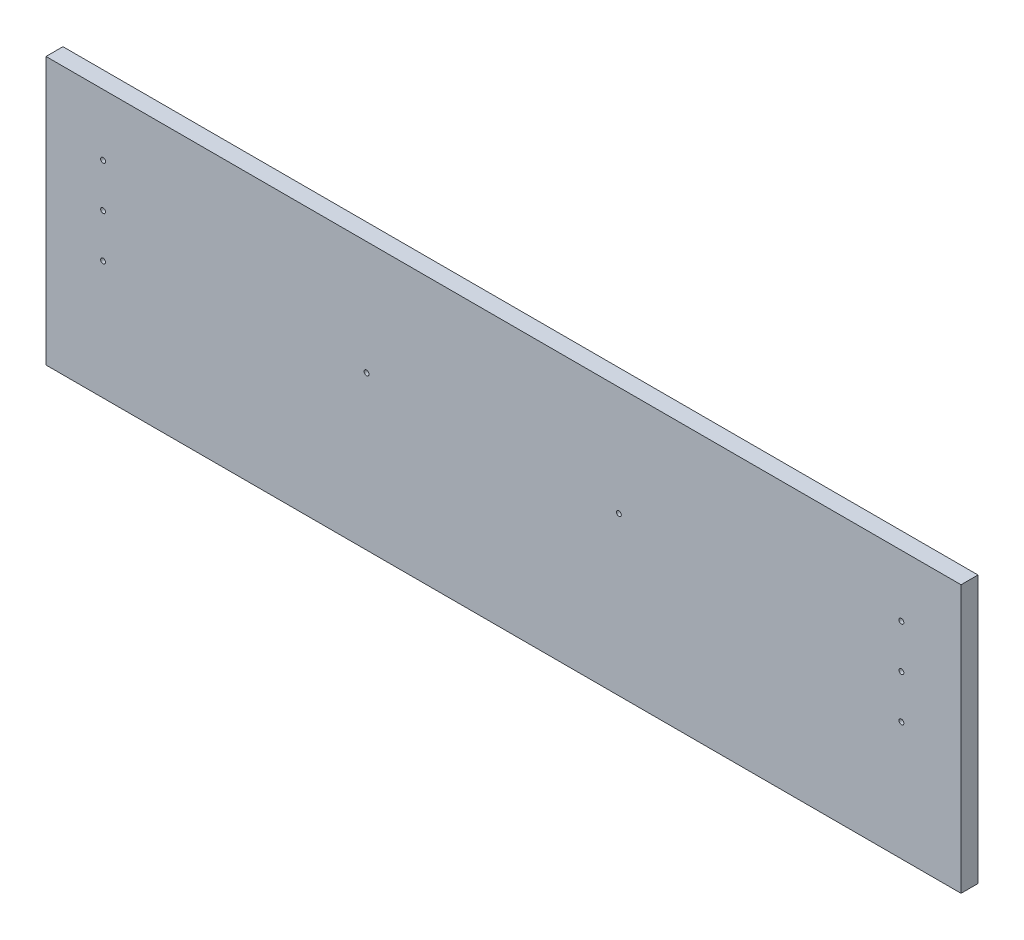
ISO-10303-21;
HEADER;
FILE_DESCRIPTION(('STEP AP214'),'2;1');
FILE_NAME('part.step','',(''),(''),'','','');
FILE_SCHEMA(('AUTOMOTIVE_DESIGN { 1 0 10303 214 1 1 1 1 }'));
ENDSEC;
DATA;
#1=APPLICATION_CONTEXT('core data for automotive mechanical design processes');
#2=APPLICATION_PROTOCOL_DEFINITION('international standard','automotive_design',2000,#1);
#3=PRODUCT_CONTEXT('',#1,'mechanical');
#4=PRODUCT('Part','Part','',(#3));
#5=PRODUCT_RELATED_PRODUCT_CATEGORY('part','',(#4));
#6=PRODUCT_DEFINITION_FORMATION('','',#4);
#7=PRODUCT_DEFINITION_CONTEXT('part definition',#1,'design');
#8=PRODUCT_DEFINITION('design','',#6,#7);
#9=PRODUCT_DEFINITION_SHAPE('','',#8);
#10=(LENGTH_UNIT() NAMED_UNIT(*) SI_UNIT(.MILLI.,.METRE.));
#11=(NAMED_UNIT(*) PLANE_ANGLE_UNIT() SI_UNIT($,.RADIAN.));
#12=(NAMED_UNIT(*) SI_UNIT($,.STERADIAN.) SOLID_ANGLE_UNIT());
#13=UNCERTAINTY_MEASURE_WITH_UNIT(LENGTH_MEASURE(1.E-05),#10,'distance_accuracy_value','');
#14=(GEOMETRIC_REPRESENTATION_CONTEXT(3) GLOBAL_UNCERTAINTY_ASSIGNED_CONTEXT((#13)) GLOBAL_UNIT_ASSIGNED_CONTEXT((#10,
#11,#12)) REPRESENTATION_CONTEXT('',''));
#15=CARTESIAN_POINT('',(0.,0.,0.));
#16=DIRECTION('',(0.,0.,1.));
#17=DIRECTION('',(1.,0.,0.));
#18=AXIS2_PLACEMENT_3D('',#15,#16,#17);
#19=CARTESIAN_POINT('',(-1865.91988168822,503.735981281029,19.));
#20=DIRECTION('',(1.,0.,0.));
#21=DIRECTION('',(0.,0.,-1.));
#22=AXIS2_PLACEMENT_3D('',#19,#20,#21);
#23=PLANE('',#22);
#24=DIRECTION('',(0.,-1.,0.));
#25=VECTOR('',#24,1.);
#26=CARTESIAN_POINT('',(-1865.91988168822,503.735981281029,0.));
#27=LINE('',#26,#25);
#28=CARTESIAN_POINT('',(-1865.91988168822,803.235981281028,0.));
#29=VERTEX_POINT('',#28);
#30=CARTESIAN_POINT('',(-1865.91988168822,503.735981281029,0.));
#31=VERTEX_POINT('',#30);
#32=EDGE_CURVE('E95',#29,#31,#27,.T.);
#33=ORIENTED_EDGE('',*,*,#32,.T.);
#34=DIRECTION('',(0.,0.,-1.));
#35=VECTOR('',#34,1.);
#36=CARTESIAN_POINT('',(-1865.91988168822,503.735981281029,19.));
#37=LINE('',#36,#35);
#38=CARTESIAN_POINT('',(-1865.91988168822,503.735981281029,19.));
#39=VERTEX_POINT('',#38);
#40=EDGE_CURVE('E11',#39,#31,#37,.T.);
#41=ORIENTED_EDGE('',*,*,#40,.F.);
#42=DIRECTION('',(0.,-1.,0.));
#43=VECTOR('',#42,1.);
#44=CARTESIAN_POINT('',(-1865.91988168822,503.735981281029,19.));
#45=LINE('',#44,#43);
#46=CARTESIAN_POINT('',(-1865.91988168822,803.235981281028,19.));
#47=VERTEX_POINT('',#46);
#48=EDGE_CURVE('E83',#47,#39,#45,.T.);
#49=ORIENTED_EDGE('',*,*,#48,.F.);
#50=DIRECTION('',(0.,0.,-1.));
#51=VECTOR('',#50,1.);
#52=CARTESIAN_POINT('',(-1865.91988168822,803.235981281028,19.));
#53=LINE('',#52,#51);
#54=EDGE_CURVE('E91',#47,#29,#53,.T.);
#55=ORIENTED_EDGE('',*,*,#54,.T.);
#56=EDGE_LOOP('',(#33,#41,#49,#55));
#57=FACE_BOUND('',#56,.T.);
#58=ADVANCED_FACE('F32',(#57),#23,.F.);
#59=CARTESIAN_POINT('',(-1865.91988168822,503.735981281029,19.));
#60=DIRECTION('',(0.,1.,0.));
#61=DIRECTION('',(0.,0.,1.));
#62=AXIS2_PLACEMENT_3D('',#59,#60,#61);
#63=PLANE('',#62);
#64=DIRECTION('',(1.,0.,0.));
#65=VECTOR('',#64,1.);
#66=CARTESIAN_POINT('',(-1865.91988168822,503.735981281029,0.));
#67=LINE('',#66,#65);
#68=CARTESIAN_POINT('',(-840.458601323646,503.735981281029,0.));
#69=VERTEX_POINT('',#68);
#70=EDGE_CURVE('E87',#31,#69,#67,.T.);
#71=ORIENTED_EDGE('',*,*,#70,.T.);
#72=DIRECTION('',(0.,0.,-1.));
#73=VECTOR('',#72,1.);
#74=CARTESIAN_POINT('',(-840.458601323646,503.735981281029,19.));
#75=LINE('',#74,#73);
#76=CARTESIAN_POINT('',(-840.458601323646,503.735981281029,19.));
#77=VERTEX_POINT('',#76);
#78=EDGE_CURVE('E40',#77,#69,#75,.T.);
#79=ORIENTED_EDGE('',*,*,#78,.F.);
#80=DIRECTION('',(1.,0.,0.));
#81=VECTOR('',#80,1.);
#82=CARTESIAN_POINT('',(-1865.91988168822,503.735981281029,19.));
#83=LINE('',#82,#81);
#84=EDGE_CURVE('E78',#39,#77,#83,.T.);
#85=ORIENTED_EDGE('',*,*,#84,.F.);
#86=ORIENTED_EDGE('',*,*,#40,.T.);
#87=EDGE_LOOP('',(#71,#79,#85,#86));
#88=FACE_BOUND('',#87,.T.);
#89=ADVANCED_FACE('F86',(#88),#63,.F.);
#90=CARTESIAN_POINT('',(-840.458601323646,503.735981281029,19.));
#91=DIRECTION('',(-1.,0.,0.));
#92=DIRECTION('',(0.,0.,1.));
#93=AXIS2_PLACEMENT_3D('',#90,#91,#92);
#94=PLANE('',#93);
#95=DIRECTION('',(0.,1.,0.));
#96=VECTOR('',#95,1.);
#97=CARTESIAN_POINT('',(-840.458601323646,503.735981281029,0.));
#98=LINE('',#97,#96);
#99=CARTESIAN_POINT('',(-840.458601323646,803.235981281028,0.));
#100=VERTEX_POINT('',#99);
#101=EDGE_CURVE('E65',#69,#100,#98,.T.);
#102=ORIENTED_EDGE('',*,*,#101,.T.);
#103=DIRECTION('',(0.,0.,-1.));
#104=VECTOR('',#103,1.);
#105=CARTESIAN_POINT('',(-840.458601323646,803.235981281028,19.));
#106=LINE('',#105,#104);
#107=CARTESIAN_POINT('',(-840.458601323646,803.235981281028,19.));
#108=VERTEX_POINT('',#107);
#109=EDGE_CURVE('E88',#108,#100,#106,.T.);
#110=ORIENTED_EDGE('',*,*,#109,.F.);
#111=DIRECTION('',(0.,1.,0.));
#112=VECTOR('',#111,1.);
#113=CARTESIAN_POINT('',(-840.458601323646,503.735981281029,19.));
#114=LINE('',#113,#112);
#115=EDGE_CURVE('E81',#77,#108,#114,.T.);
#116=ORIENTED_EDGE('',*,*,#115,.F.);
#117=ORIENTED_EDGE('',*,*,#78,.T.);
#118=EDGE_LOOP('',(#102,#110,#116,#117));
#119=FACE_BOUND('',#118,.T.);
#120=ADVANCED_FACE('F89',(#119),#94,.F.);
#121=CARTESIAN_POINT('',(-1865.91988168822,803.235981281028,19.));
#122=DIRECTION('',(0.,-1.,0.));
#123=DIRECTION('',(0.,0.,-1.));
#124=AXIS2_PLACEMENT_3D('',#121,#122,#123);
#125=PLANE('',#124);
#126=DIRECTION('',(-1.,0.,0.));
#127=VECTOR('',#126,1.);
#128=CARTESIAN_POINT('',(-1865.91988168822,803.235981281028,0.));
#129=LINE('',#128,#127);
#130=EDGE_CURVE('E71',#100,#29,#129,.T.);
#131=ORIENTED_EDGE('',*,*,#130,.T.);
#132=ORIENTED_EDGE('',*,*,#54,.F.);
#133=DIRECTION('',(-1.,0.,0.));
#134=VECTOR('',#133,1.);
#135=CARTESIAN_POINT('',(-1865.91988168822,803.235981281028,19.));
#136=LINE('',#135,#134);
#137=EDGE_CURVE('E48',#108,#47,#136,.T.);
#138=ORIENTED_EDGE('',*,*,#137,.F.);
#139=ORIENTED_EDGE('',*,*,#109,.T.);
#140=EDGE_LOOP('',(#131,#132,#138,#139));
#141=FACE_BOUND('',#140,.T.);
#142=ADVANCED_FACE('F103',(#141),#125,.F.);
#143=CARTESIAN_POINT('',(0.,0.,19.));
#144=DIRECTION('',(0.,0.,-1.));
#145=DIRECTION('',(-1.,0.,0.));
#146=AXIS2_PLACEMENT_3D('',#143,#144,#145);
#147=PLANE('',#146);
#148=CARTESIAN_POINT('',(-1801.94296472096,734.466309612033,19.));
#149=DIRECTION('',(0.,0.,-1.));
#150=DIRECTION('',(-1.,0.,0.));
#151=AXIS2_PLACEMENT_3D('',#148,#149,#150);
#152=CIRCLE('',#151,2.75000000000003);
#153=CARTESIAN_POINT('',(-1804.69296472096,734.466309612033,19.));
#154=VERTEX_POINT('',#153);
#155=EDGE_CURVE('E150',#154,#154,#152,.T.);
#156=ORIENTED_EDGE('',*,*,#155,.T.);
#157=EDGE_LOOP('',(#156));
#158=FACE_BOUND('',#157,.T.);
#159=CARTESIAN_POINT('',(-1801.94296472096,685.60086817557,19.));
#160=DIRECTION('',(0.,0.,-1.));
#161=DIRECTION('',(-1.,0.,0.));
#162=AXIS2_PLACEMENT_3D('',#159,#160,#161);
#163=CIRCLE('',#162,2.75000000000003);
#164=CARTESIAN_POINT('',(-1804.69296472096,685.60086817557,19.));
#165=VERTEX_POINT('',#164);
#166=EDGE_CURVE('E144',#165,#165,#163,.T.);
#167=ORIENTED_EDGE('',*,*,#166,.T.);
#168=EDGE_LOOP('',(#167));
#169=FACE_BOUND('',#168,.T.);
#170=CARTESIAN_POINT('',(-1801.94296472096,636.730868960784,19.));
#171=DIRECTION('',(0.,0.,-1.));
#172=DIRECTION('',(-1.,0.,0.));
#173=AXIS2_PLACEMENT_3D('',#170,#171,#172);
#174=CIRCLE('',#173,2.75000000000003);
#175=CARTESIAN_POINT('',(-1804.69296472096,636.730868960784,19.));
#176=VERTEX_POINT('',#175);
#177=EDGE_CURVE('E138',#176,#176,#174,.T.);
#178=ORIENTED_EDGE('',*,*,#177,.T.);
#179=EDGE_LOOP('',(#178));
#180=FACE_BOUND('',#179,.T.);
#181=CARTESIAN_POINT('',(-907.32133425273,734.466309612041,19.));
#182=DIRECTION('',(0.,0.,-1.));
#183=DIRECTION('',(-1.,0.,0.));
#184=AXIS2_PLACEMENT_3D('',#181,#182,#183);
#185=CIRCLE('',#184,2.75000000000003);
#186=CARTESIAN_POINT('',(-910.07133425273,734.466309612041,19.));
#187=VERTEX_POINT('',#186);
#188=EDGE_CURVE('E132',#187,#187,#185,.T.);
#189=ORIENTED_EDGE('',*,*,#188,.T.);
#190=EDGE_LOOP('',(#189));
#191=FACE_BOUND('',#190,.T.);
#192=CARTESIAN_POINT('',(-907.32133425273,685.595868960792,19.));
#193=DIRECTION('',(0.,0.,-1.));
#194=DIRECTION('',(-1.,0.,0.));
#195=AXIS2_PLACEMENT_3D('',#192,#193,#194);
#196=CIRCLE('',#195,2.75000000000003);
#197=CARTESIAN_POINT('',(-910.07133425273,685.595868960792,19.));
#198=VERTEX_POINT('',#197);
#199=EDGE_CURVE('E126',#198,#198,#196,.T.);
#200=ORIENTED_EDGE('',*,*,#199,.T.);
#201=EDGE_LOOP('',(#200));
#202=FACE_BOUND('',#201,.T.);
#203=CARTESIAN_POINT('',(-907.321334252729,636.736313815604,19.));
#204=DIRECTION('',(0.,0.,-1.));
#205=DIRECTION('',(-1.,0.,0.));
#206=AXIS2_PLACEMENT_3D('',#203,#204,#205);
#207=CIRCLE('',#206,2.75000000000003);
#208=CARTESIAN_POINT('',(-910.071334252729,636.736313815604,19.));
#209=VERTEX_POINT('',#208);
#210=EDGE_CURVE('E120',#209,#209,#207,.T.);
#211=ORIENTED_EDGE('',*,*,#210,.T.);
#212=EDGE_LOOP('',(#211));
#213=FACE_BOUND('',#212,.T.);
#214=CARTESIAN_POINT('',(-1223.96319940512,680.679650287803,19.));
#215=DIRECTION('',(0.,0.,-1.));
#216=DIRECTION('',(-1.,0.,0.));
#217=AXIS2_PLACEMENT_3D('',#214,#215,#216);
#218=CIRCLE('',#217,2.75000000000003);
#219=CARTESIAN_POINT('',(-1226.71319940512,680.679650287803,19.));
#220=VERTEX_POINT('',#219);
#221=EDGE_CURVE('E114',#220,#220,#218,.T.);
#222=ORIENTED_EDGE('',*,*,#221,.T.);
#223=EDGE_LOOP('',(#222));
#224=FACE_BOUND('',#223,.T.);
#225=CARTESIAN_POINT('',(-1506.67598122684,675.762846283049,19.));
#226=DIRECTION('',(0.,0.,-1.));
#227=DIRECTION('',(-1.,0.,0.));
#228=AXIS2_PLACEMENT_3D('',#225,#226,#227);
#229=CIRCLE('',#228,2.75000000000003);
#230=CARTESIAN_POINT('',(-1509.42598122684,675.762846283049,19.));
#231=VERTEX_POINT('',#230);
#232=EDGE_CURVE('E98',#231,#231,#229,.T.);
#233=ORIENTED_EDGE('',*,*,#232,.T.);
#234=EDGE_LOOP('',(#233));
#235=FACE_BOUND('',#234,.T.);
#236=ORIENTED_EDGE('',*,*,#48,.T.);
#237=ORIENTED_EDGE('',*,*,#84,.T.);
#238=ORIENTED_EDGE('',*,*,#115,.T.);
#239=ORIENTED_EDGE('',*,*,#137,.T.);
#240=EDGE_LOOP('',(#236,#237,#238,#239));
#241=FACE_BOUND('',#240,.T.);
#242=ADVANCED_FACE('F79',(#158,#169,#180,#191,#202,#213,#224,#235,#241),#147,.F.);
#243=CARTESIAN_POINT('',(0.,0.,0.));
#244=DIRECTION('',(0.,0.,-1.));
#245=DIRECTION('',(-1.,0.,0.));
#246=AXIS2_PLACEMENT_3D('',#243,#244,#245);
#247=PLANE('',#246);
#248=CARTESIAN_POINT('',(-1801.94296472096,734.466309612033,0.));
#249=DIRECTION('',(0.,0.,-1.));
#250=DIRECTION('',(-1.,0.,0.));
#251=AXIS2_PLACEMENT_3D('',#248,#249,#250);
#252=CIRCLE('',#251,2.75000000000003);
#253=CARTESIAN_POINT('',(-1804.69296472096,734.466309612033,0.));
#254=VERTEX_POINT('',#253);
#255=EDGE_CURVE('E153',#254,#254,#252,.T.);
#256=ORIENTED_EDGE('',*,*,#255,.F.);
#257=EDGE_LOOP('',(#256));
#258=FACE_BOUND('',#257,.T.);
#259=CARTESIAN_POINT('',(-1801.94296472096,685.60086817557,0.));
#260=DIRECTION('',(0.,0.,-1.));
#261=DIRECTION('',(-1.,0.,0.));
#262=AXIS2_PLACEMENT_3D('',#259,#260,#261);
#263=CIRCLE('',#262,2.75000000000003);
#264=CARTESIAN_POINT('',(-1804.69296472096,685.60086817557,0.));
#265=VERTEX_POINT('',#264);
#266=EDGE_CURVE('E147',#265,#265,#263,.T.);
#267=ORIENTED_EDGE('',*,*,#266,.F.);
#268=EDGE_LOOP('',(#267));
#269=FACE_BOUND('',#268,.T.);
#270=CARTESIAN_POINT('',(-1801.94296472096,636.730868960784,0.));
#271=DIRECTION('',(0.,0.,-1.));
#272=DIRECTION('',(-1.,0.,0.));
#273=AXIS2_PLACEMENT_3D('',#270,#271,#272);
#274=CIRCLE('',#273,2.75000000000003);
#275=CARTESIAN_POINT('',(-1804.69296472096,636.730868960784,0.));
#276=VERTEX_POINT('',#275);
#277=EDGE_CURVE('E141',#276,#276,#274,.T.);
#278=ORIENTED_EDGE('',*,*,#277,.F.);
#279=EDGE_LOOP('',(#278));
#280=FACE_BOUND('',#279,.T.);
#281=CARTESIAN_POINT('',(-907.32133425273,734.466309612041,0.));
#282=DIRECTION('',(0.,0.,-1.));
#283=DIRECTION('',(-1.,0.,0.));
#284=AXIS2_PLACEMENT_3D('',#281,#282,#283);
#285=CIRCLE('',#284,2.75000000000003);
#286=CARTESIAN_POINT('',(-910.07133425273,734.466309612041,0.));
#287=VERTEX_POINT('',#286);
#288=EDGE_CURVE('E135',#287,#287,#285,.T.);
#289=ORIENTED_EDGE('',*,*,#288,.F.);
#290=EDGE_LOOP('',(#289));
#291=FACE_BOUND('',#290,.T.);
#292=CARTESIAN_POINT('',(-907.32133425273,685.595868960792,0.));
#293=DIRECTION('',(0.,0.,-1.));
#294=DIRECTION('',(-1.,0.,0.));
#295=AXIS2_PLACEMENT_3D('',#292,#293,#294);
#296=CIRCLE('',#295,2.75000000000003);
#297=CARTESIAN_POINT('',(-910.07133425273,685.595868960792,0.));
#298=VERTEX_POINT('',#297);
#299=EDGE_CURVE('E129',#298,#298,#296,.T.);
#300=ORIENTED_EDGE('',*,*,#299,.F.);
#301=EDGE_LOOP('',(#300));
#302=FACE_BOUND('',#301,.T.);
#303=CARTESIAN_POINT('',(-907.321334252729,636.736313815604,0.));
#304=DIRECTION('',(0.,0.,-1.));
#305=DIRECTION('',(-1.,0.,0.));
#306=AXIS2_PLACEMENT_3D('',#303,#304,#305);
#307=CIRCLE('',#306,2.75000000000003);
#308=CARTESIAN_POINT('',(-910.071334252729,636.736313815604,0.));
#309=VERTEX_POINT('',#308);
#310=EDGE_CURVE('E123',#309,#309,#307,.T.);
#311=ORIENTED_EDGE('',*,*,#310,.F.);
#312=EDGE_LOOP('',(#311));
#313=FACE_BOUND('',#312,.T.);
#314=CARTESIAN_POINT('',(-1223.96319940512,680.679650287803,0.));
#315=DIRECTION('',(0.,0.,-1.));
#316=DIRECTION('',(-1.,0.,0.));
#317=AXIS2_PLACEMENT_3D('',#314,#315,#316);
#318=CIRCLE('',#317,2.75000000000003);
#319=CARTESIAN_POINT('',(-1226.71319940512,680.679650287803,0.));
#320=VERTEX_POINT('',#319);
#321=EDGE_CURVE('E117',#320,#320,#318,.T.);
#322=ORIENTED_EDGE('',*,*,#321,.F.);
#323=EDGE_LOOP('',(#322));
#324=FACE_BOUND('',#323,.T.);
#325=CARTESIAN_POINT('',(-1506.67598122684,675.762846283049,0.));
#326=DIRECTION('',(0.,0.,-1.));
#327=DIRECTION('',(-1.,0.,0.));
#328=AXIS2_PLACEMENT_3D('',#325,#326,#327);
#329=CIRCLE('',#328,2.75000000000003);
#330=CARTESIAN_POINT('',(-1509.42598122684,675.762846283049,0.));
#331=VERTEX_POINT('',#330);
#332=EDGE_CURVE('E111',#331,#331,#329,.T.);
#333=ORIENTED_EDGE('',*,*,#332,.F.);
#334=EDGE_LOOP('',(#333));
#335=FACE_BOUND('',#334,.T.);
#336=ORIENTED_EDGE('',*,*,#32,.F.);
#337=ORIENTED_EDGE('',*,*,#130,.F.);
#338=ORIENTED_EDGE('',*,*,#101,.F.);
#339=ORIENTED_EDGE('',*,*,#70,.F.);
#340=EDGE_LOOP('',(#336,#337,#338,#339));
#341=FACE_BOUND('',#340,.T.);
#342=ADVANCED_FACE('F106',(#258,#269,#280,#291,#302,#313,#324,#335,#341),#247,.T.);
#343=CARTESIAN_POINT('',(-1506.67598122684,675.762846283049,0.));
#344=DIRECTION('',(0.,0.,-1.));
#345=DIRECTION('',(-1.,0.,0.));
#346=AXIS2_PLACEMENT_3D('',#343,#344,#345);
#347=CYLINDRICAL_SURFACE('',#346,2.75000000000003);
#348=ORIENTED_EDGE('',*,*,#332,.T.);
#349=EDGE_LOOP('',(#348));
#350=FACE_BOUND('',#349,.T.);
#351=ORIENTED_EDGE('',*,*,#232,.F.);
#352=EDGE_LOOP('',(#351));
#353=FACE_BOUND('',#352,.T.);
#354=ADVANCED_FACE('F162',(#350,#353),#347,.F.);
#355=CARTESIAN_POINT('',(-1223.96319940512,680.679650287803,0.));
#356=DIRECTION('',(0.,0.,-1.));
#357=DIRECTION('',(-1.,0.,0.));
#358=AXIS2_PLACEMENT_3D('',#355,#356,#357);
#359=CYLINDRICAL_SURFACE('',#358,2.75000000000003);
#360=ORIENTED_EDGE('',*,*,#321,.T.);
#361=EDGE_LOOP('',(#360));
#362=FACE_BOUND('',#361,.T.);
#363=ORIENTED_EDGE('',*,*,#221,.F.);
#364=EDGE_LOOP('',(#363));
#365=FACE_BOUND('',#364,.T.);
#366=ADVANCED_FACE('F180',(#362,#365),#359,.F.);
#367=CARTESIAN_POINT('',(-907.321334252729,636.736313815604,0.));
#368=DIRECTION('',(0.,0.,-1.));
#369=DIRECTION('',(-1.,0.,0.));
#370=AXIS2_PLACEMENT_3D('',#367,#368,#369);
#371=CYLINDRICAL_SURFACE('',#370,2.75000000000003);
#372=ORIENTED_EDGE('',*,*,#310,.T.);
#373=EDGE_LOOP('',(#372));
#374=FACE_BOUND('',#373,.T.);
#375=ORIENTED_EDGE('',*,*,#210,.F.);
#376=EDGE_LOOP('',(#375));
#377=FACE_BOUND('',#376,.T.);
#378=ADVANCED_FACE('F231',(#374,#377),#371,.F.);
#379=CARTESIAN_POINT('',(-907.32133425273,685.595868960792,0.));
#380=DIRECTION('',(0.,0.,-1.));
#381=DIRECTION('',(-1.,0.,0.));
#382=AXIS2_PLACEMENT_3D('',#379,#380,#381);
#383=CYLINDRICAL_SURFACE('',#382,2.75000000000003);
#384=ORIENTED_EDGE('',*,*,#299,.T.);
#385=EDGE_LOOP('',(#384));
#386=FACE_BOUND('',#385,.T.);
#387=ORIENTED_EDGE('',*,*,#199,.F.);
#388=EDGE_LOOP('',(#387));
#389=FACE_BOUND('',#388,.T.);
#390=ADVANCED_FACE('F241',(#386,#389),#383,.F.);
#391=CARTESIAN_POINT('',(-907.32133425273,734.466309612041,0.));
#392=DIRECTION('',(0.,0.,-1.));
#393=DIRECTION('',(-1.,0.,0.));
#394=AXIS2_PLACEMENT_3D('',#391,#392,#393);
#395=CYLINDRICAL_SURFACE('',#394,2.75000000000003);
#396=ORIENTED_EDGE('',*,*,#288,.T.);
#397=EDGE_LOOP('',(#396));
#398=FACE_BOUND('',#397,.T.);
#399=ORIENTED_EDGE('',*,*,#188,.F.);
#400=EDGE_LOOP('',(#399));
#401=FACE_BOUND('',#400,.T.);
#402=ADVANCED_FACE('F251',(#398,#401),#395,.F.);
#403=CARTESIAN_POINT('',(-1801.94296472096,636.730868960784,0.));
#404=DIRECTION('',(0.,0.,-1.));
#405=DIRECTION('',(-1.,0.,0.));
#406=AXIS2_PLACEMENT_3D('',#403,#404,#405);
#407=CYLINDRICAL_SURFACE('',#406,2.75000000000003);
#408=ORIENTED_EDGE('',*,*,#277,.T.);
#409=EDGE_LOOP('',(#408));
#410=FACE_BOUND('',#409,.T.);
#411=ORIENTED_EDGE('',*,*,#177,.F.);
#412=EDGE_LOOP('',(#411));
#413=FACE_BOUND('',#412,.T.);
#414=ADVANCED_FACE('F261',(#410,#413),#407,.F.);
#415=CARTESIAN_POINT('',(-1801.94296472096,685.60086817557,0.));
#416=DIRECTION('',(0.,0.,-1.));
#417=DIRECTION('',(-1.,0.,0.));
#418=AXIS2_PLACEMENT_3D('',#415,#416,#417);
#419=CYLINDRICAL_SURFACE('',#418,2.75000000000003);
#420=ORIENTED_EDGE('',*,*,#266,.T.);
#421=EDGE_LOOP('',(#420));
#422=FACE_BOUND('',#421,.T.);
#423=ORIENTED_EDGE('',*,*,#166,.F.);
#424=EDGE_LOOP('',(#423));
#425=FACE_BOUND('',#424,.T.);
#426=ADVANCED_FACE('F271',(#422,#425),#419,.F.);
#427=CARTESIAN_POINT('',(-1801.94296472096,734.466309612033,0.));
#428=DIRECTION('',(0.,0.,-1.));
#429=DIRECTION('',(-1.,0.,0.));
#430=AXIS2_PLACEMENT_3D('',#427,#428,#429);
#431=CYLINDRICAL_SURFACE('',#430,2.75000000000003);
#432=ORIENTED_EDGE('',*,*,#255,.T.);
#433=EDGE_LOOP('',(#432));
#434=FACE_BOUND('',#433,.T.);
#435=ORIENTED_EDGE('',*,*,#155,.F.);
#436=EDGE_LOOP('',(#435));
#437=FACE_BOUND('',#436,.T.);
#438=ADVANCED_FACE('F157',(#434,#437),#431,.F.);
#439=CLOSED_SHELL('',(#58,#89,#120,#142,#242,#342,#354,#366,#378,#390,#402,#414,#426,#438));
#440=MANIFOLD_SOLID_BREP('B2',#439);
#441=ADVANCED_BREP_SHAPE_REPRESENTATION('',(#18,#440),#14);
#442=SHAPE_DEFINITION_REPRESENTATION(#9,#441);
ENDSEC;
END-ISO-10303-21;
